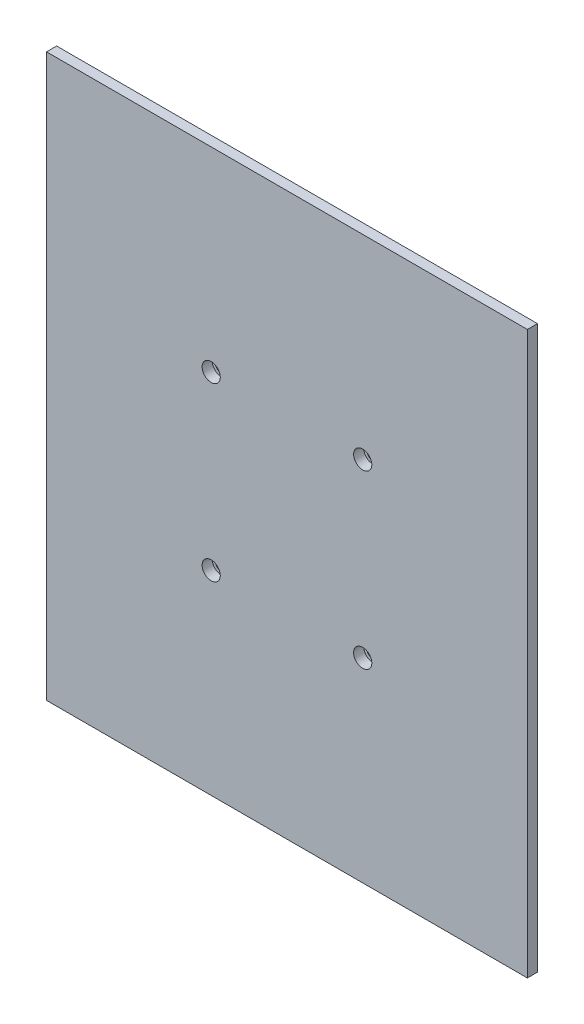
ISO-10303-21;
HEADER;
FILE_DESCRIPTION(('STEP AP214'),'2;1');
FILE_NAME('part.step','',(''),(''),'','','');
FILE_SCHEMA(('AUTOMOTIVE_DESIGN { 1 0 10303 214 1 1 1 1 }'));
ENDSEC;
DATA;
#1=APPLICATION_CONTEXT('core data for automotive mechanical design processes');
#2=APPLICATION_PROTOCOL_DEFINITION('international standard','automotive_design',2000,#1);
#3=PRODUCT_CONTEXT('',#1,'mechanical');
#4=PRODUCT('Part','Part','',(#3));
#5=PRODUCT_RELATED_PRODUCT_CATEGORY('part','',(#4));
#6=PRODUCT_DEFINITION_FORMATION('','',#4);
#7=PRODUCT_DEFINITION_CONTEXT('part definition',#1,'design');
#8=PRODUCT_DEFINITION('design','',#6,#7);
#9=PRODUCT_DEFINITION_SHAPE('','',#8);
#10=(LENGTH_UNIT() NAMED_UNIT(*) SI_UNIT(.MILLI.,.METRE.));
#11=(NAMED_UNIT(*) PLANE_ANGLE_UNIT() SI_UNIT($,.RADIAN.));
#12=(NAMED_UNIT(*) SI_UNIT($,.STERADIAN.) SOLID_ANGLE_UNIT());
#13=UNCERTAINTY_MEASURE_WITH_UNIT(LENGTH_MEASURE(1.E-05),#10,'distance_accuracy_value','');
#14=(GEOMETRIC_REPRESENTATION_CONTEXT(3) GLOBAL_UNCERTAINTY_ASSIGNED_CONTEXT((#13)) GLOBAL_UNIT_ASSIGNED_CONTEXT((#10,
#11,#12)) REPRESENTATION_CONTEXT('',''));
#15=CARTESIAN_POINT('',(0.,0.,0.));
#16=DIRECTION('',(0.,0.,1.));
#17=DIRECTION('',(1.,0.,0.));
#18=AXIS2_PLACEMENT_3D('',#15,#16,#17);
#19=CARTESIAN_POINT('',(10.,-95.,5.));
#20=DIRECTION('',(0.,0.,-1.));
#21=DIRECTION('',(-1.,0.,0.));
#22=AXIS2_PLACEMENT_3D('',#19,#20,#21);
#23=CYLINDRICAL_SURFACE('',#22,4.5);
#24=CARTESIAN_POINT('',(10.,-95.,10.));
#25=DIRECTION('',(0.,0.,-1.));
#26=DIRECTION('',(-1.,0.,0.));
#27=AXIS2_PLACEMENT_3D('',#24,#25,#26);
#28=CIRCLE('',#27,4.5);
#29=CARTESIAN_POINT('',(5.50000000000001,-95.,10.));
#30=VERTEX_POINT('',#29);
#31=EDGE_CURVE('E259',#30,#30,#28,.T.);
#32=ORIENTED_EDGE('',*,*,#31,.F.);
#33=EDGE_LOOP('',(#32));
#34=FACE_BOUND('',#33,.T.);
#35=CARTESIAN_POINT('',(10.,-95.,5.));
#36=DIRECTION('',(0.,0.,-1.));
#37=DIRECTION('',(-1.,0.,0.));
#38=AXIS2_PLACEMENT_3D('',#35,#36,#37);
#39=CIRCLE('',#38,4.5);
#40=CARTESIAN_POINT('',(5.50000000000001,-95.,5.));
#41=VERTEX_POINT('',#40);
#42=EDGE_CURVE('E11',#41,#41,#39,.F.);
#43=ORIENTED_EDGE('',*,*,#42,.F.);
#44=EDGE_LOOP('',(#43));
#45=FACE_BOUND('',#44,.T.);
#46=ADVANCED_FACE('F33',(#34,#45),#23,.F.);
#47=CARTESIAN_POINT('',(85.,-95.,5.));
#48=DIRECTION('',(0.,0.,-1.));
#49=DIRECTION('',(-1.,0.,0.));
#50=AXIS2_PLACEMENT_3D('',#47,#48,#49);
#51=CYLINDRICAL_SURFACE('',#50,4.50000000000001);
#52=CARTESIAN_POINT('',(85.,-95.,10.));
#53=DIRECTION('',(0.,0.,-1.));
#54=DIRECTION('',(-1.,0.,0.));
#55=AXIS2_PLACEMENT_3D('',#52,#53,#54);
#56=CIRCLE('',#55,4.50000000000001);
#57=CARTESIAN_POINT('',(80.5,-95.,10.));
#58=VERTEX_POINT('',#57);
#59=EDGE_CURVE('E256',#58,#58,#56,.T.);
#60=ORIENTED_EDGE('',*,*,#59,.F.);
#61=EDGE_LOOP('',(#60));
#62=FACE_BOUND('',#61,.T.);
#63=CARTESIAN_POINT('',(85.,-95.,5.));
#64=DIRECTION('',(0.,0.,-1.));
#65=DIRECTION('',(-1.,0.,0.));
#66=AXIS2_PLACEMENT_3D('',#63,#64,#65);
#67=CIRCLE('',#66,4.50000000000001);
#68=CARTESIAN_POINT('',(80.5,-95.,5.));
#69=VERTEX_POINT('',#68);
#70=EDGE_CURVE('E41',#69,#69,#67,.F.);
#71=ORIENTED_EDGE('',*,*,#70,.F.);
#72=EDGE_LOOP('',(#71));
#73=FACE_BOUND('',#72,.T.);
#74=ADVANCED_FACE('F168',(#62,#73),#51,.F.);
#75=CARTESIAN_POINT('',(10.,-9.99999999999999,5.));
#76=DIRECTION('',(0.,0.,-1.));
#77=DIRECTION('',(-1.,0.,0.));
#78=AXIS2_PLACEMENT_3D('',#75,#76,#77);
#79=CYLINDRICAL_SURFACE('',#78,4.5);
#80=CARTESIAN_POINT('',(10.,-9.99999999999999,10.));
#81=DIRECTION('',(0.,0.,-1.));
#82=DIRECTION('',(-1.,0.,0.));
#83=AXIS2_PLACEMENT_3D('',#80,#81,#82);
#84=CIRCLE('',#83,4.5);
#85=CARTESIAN_POINT('',(5.50000000000001,-9.99999999999999,10.));
#86=VERTEX_POINT('',#85);
#87=EDGE_CURVE('E254',#86,#86,#84,.T.);
#88=ORIENTED_EDGE('',*,*,#87,.F.);
#89=EDGE_LOOP('',(#88));
#90=FACE_BOUND('',#89,.T.);
#91=CARTESIAN_POINT('',(10.,-9.99999999999999,5.));
#92=DIRECTION('',(0.,0.,-1.));
#93=DIRECTION('',(-1.,0.,0.));
#94=AXIS2_PLACEMENT_3D('',#91,#92,#93);
#95=CIRCLE('',#94,4.5);
#96=CARTESIAN_POINT('',(5.50000000000001,-9.99999999999999,5.));
#97=VERTEX_POINT('',#96);
#98=EDGE_CURVE('E161',#97,#97,#95,.F.);
#99=ORIENTED_EDGE('',*,*,#98,.F.);
#100=EDGE_LOOP('',(#99));
#101=FACE_BOUND('',#100,.T.);
#102=ADVANCED_FACE('F170',(#90,#101),#79,.F.);
#103=CARTESIAN_POINT('',(85.,-9.99999999999999,5.));
#104=DIRECTION('',(0.,0.,-1.));
#105=DIRECTION('',(-1.,0.,0.));
#106=AXIS2_PLACEMENT_3D('',#103,#104,#105);
#107=CYLINDRICAL_SURFACE('',#106,4.5);
#108=CARTESIAN_POINT('',(85.,-9.99999999999999,10.));
#109=DIRECTION('',(0.,0.,-1.));
#110=DIRECTION('',(-1.,0.,0.));
#111=AXIS2_PLACEMENT_3D('',#108,#109,#110);
#112=CIRCLE('',#111,4.5);
#113=CARTESIAN_POINT('',(80.5,-9.99999999999999,10.));
#114=VERTEX_POINT('',#113);
#115=EDGE_CURVE('E103',#114,#114,#112,.T.);
#116=ORIENTED_EDGE('',*,*,#115,.F.);
#117=EDGE_LOOP('',(#116));
#118=FACE_BOUND('',#117,.T.);
#119=CARTESIAN_POINT('',(85.,-9.99999999999999,5.));
#120=DIRECTION('',(0.,0.,-1.));
#121=DIRECTION('',(-1.,0.,0.));
#122=AXIS2_PLACEMENT_3D('',#119,#120,#121);
#123=CIRCLE('',#122,4.5);
#124=CARTESIAN_POINT('',(80.5,-9.99999999999999,5.));
#125=VERTEX_POINT('',#124);
#126=EDGE_CURVE('E158',#125,#125,#123,.F.);
#127=ORIENTED_EDGE('',*,*,#126,.F.);
#128=EDGE_LOOP('',(#127));
#129=FACE_BOUND('',#128,.T.);
#130=ADVANCED_FACE('F177',(#118,#129),#107,.F.);
#131=CARTESIAN_POINT('',(166.5,86.5,10.));
#132=DIRECTION('',(1.,0.,0.));
#133=DIRECTION('',(0.,0.,-1.));
#134=AXIS2_PLACEMENT_3D('',#131,#132,#133);
#135=PLANE('',#134);
#136=DIRECTION('',(0.,0.,-1.));
#137=VECTOR('',#136,1.);
#138=CARTESIAN_POINT('',(166.5,86.5,10.));
#139=LINE('',#138,#137);
#140=CARTESIAN_POINT('',(166.5,86.5,10.));
#141=VERTEX_POINT('',#140);
#142=CARTESIAN_POINT('',(166.5,86.5,5.));
#143=VERTEX_POINT('',#142);
#144=EDGE_CURVE('E111',#141,#143,#139,.T.);
#145=ORIENTED_EDGE('',*,*,#144,.F.);
#146=DIRECTION('',(0.,-1.,0.));
#147=VECTOR('',#146,1.);
#148=CARTESIAN_POINT('',(166.5,86.5,10.));
#149=LINE('',#148,#147);
#150=CARTESIAN_POINT('',(166.5,-191.5,10.));
#151=VERTEX_POINT('',#150);
#152=EDGE_CURVE('E98',#141,#151,#149,.T.);
#153=ORIENTED_EDGE('',*,*,#152,.T.);
#154=DIRECTION('',(0.,0.,-1.));
#155=VECTOR('',#154,1.);
#156=CARTESIAN_POINT('',(166.5,-191.5,10.));
#157=LINE('',#156,#155);
#158=CARTESIAN_POINT('',(166.5,-191.5,5.));
#159=VERTEX_POINT('',#158);
#160=EDGE_CURVE('E109',#151,#159,#157,.T.);
#161=ORIENTED_EDGE('',*,*,#160,.T.);
#162=DIRECTION('',(0.,-1.,0.));
#163=VECTOR('',#162,1.);
#164=CARTESIAN_POINT('',(166.5,86.5,5.));
#165=LINE('',#164,#163);
#166=EDGE_CURVE('E112',#143,#159,#165,.T.);
#167=ORIENTED_EDGE('',*,*,#166,.F.);
#168=EDGE_LOOP('',(#145,#153,#161,#167));
#169=FACE_BOUND('',#168,.T.);
#170=ADVANCED_FACE('F107',(#169),#135,.T.);
#171=CARTESIAN_POINT('',(166.5,86.5,10.));
#172=DIRECTION('',(0.,1.,0.));
#173=DIRECTION('',(0.,0.,1.));
#174=AXIS2_PLACEMENT_3D('',#171,#172,#173);
#175=PLANE('',#174);
#176=DIRECTION('',(0.,0.,-1.));
#177=VECTOR('',#176,1.);
#178=CARTESIAN_POINT('',(-71.5,86.5,10.));
#179=LINE('',#178,#177);
#180=CARTESIAN_POINT('',(-71.5,86.5,10.));
#181=VERTEX_POINT('',#180);
#182=CARTESIAN_POINT('',(-71.5,86.5,5.));
#183=VERTEX_POINT('',#182);
#184=EDGE_CURVE('E122',#181,#183,#179,.T.);
#185=ORIENTED_EDGE('',*,*,#184,.F.);
#186=DIRECTION('',(1.,0.,0.));
#187=VECTOR('',#186,1.);
#188=CARTESIAN_POINT('',(166.5,86.5,10.));
#189=LINE('',#188,#187);
#190=EDGE_CURVE('E113',#181,#141,#189,.T.);
#191=ORIENTED_EDGE('',*,*,#190,.T.);
#192=ORIENTED_EDGE('',*,*,#144,.T.);
#193=DIRECTION('',(1.,0.,0.));
#194=VECTOR('',#193,1.);
#195=CARTESIAN_POINT('',(166.5,86.5,5.));
#196=LINE('',#195,#194);
#197=EDGE_CURVE('E120',#183,#143,#196,.T.);
#198=ORIENTED_EDGE('',*,*,#197,.F.);
#199=EDGE_LOOP('',(#185,#191,#192,#198));
#200=FACE_BOUND('',#199,.T.);
#201=ADVANCED_FACE('F278',(#200),#175,.T.);
#202=CARTESIAN_POINT('',(-71.5,86.5,10.));
#203=DIRECTION('',(-1.,0.,0.));
#204=DIRECTION('',(0.,0.,1.));
#205=AXIS2_PLACEMENT_3D('',#202,#203,#204);
#206=PLANE('',#205);
#207=DIRECTION('',(0.,0.,-1.));
#208=VECTOR('',#207,1.);
#209=CARTESIAN_POINT('',(-71.5,-191.5,10.));
#210=LINE('',#209,#208);
#211=CARTESIAN_POINT('',(-71.5,-191.5,10.));
#212=VERTEX_POINT('',#211);
#213=CARTESIAN_POINT('',(-71.5,-191.5,5.));
#214=VERTEX_POINT('',#213);
#215=EDGE_CURVE('E119',#212,#214,#210,.T.);
#216=ORIENTED_EDGE('',*,*,#215,.F.);
#217=DIRECTION('',(0.,1.,0.));
#218=VECTOR('',#217,1.);
#219=CARTESIAN_POINT('',(-71.5,86.5,10.));
#220=LINE('',#219,#218);
#221=EDGE_CURVE('E48',#212,#181,#220,.T.);
#222=ORIENTED_EDGE('',*,*,#221,.T.);
#223=ORIENTED_EDGE('',*,*,#184,.T.);
#224=DIRECTION('',(0.,1.,0.));
#225=VECTOR('',#224,1.);
#226=CARTESIAN_POINT('',(-71.5,86.5,5.));
#227=LINE('',#226,#225);
#228=EDGE_CURVE('E125',#214,#183,#227,.T.);
#229=ORIENTED_EDGE('',*,*,#228,.F.);
#230=EDGE_LOOP('',(#216,#222,#223,#229));
#231=FACE_BOUND('',#230,.T.);
#232=ADVANCED_FACE('F275',(#231),#206,.T.);
#233=CARTESIAN_POINT('',(166.5,-191.5,10.));
#234=DIRECTION('',(0.,-1.,0.));
#235=DIRECTION('',(0.,0.,-1.));
#236=AXIS2_PLACEMENT_3D('',#233,#234,#235);
#237=PLANE('',#236);
#238=ORIENTED_EDGE('',*,*,#160,.F.);
#239=DIRECTION('',(-1.,0.,0.));
#240=VECTOR('',#239,1.);
#241=CARTESIAN_POINT('',(166.5,-191.5,10.));
#242=LINE('',#241,#240);
#243=EDGE_CURVE('E95',#151,#212,#242,.T.);
#244=ORIENTED_EDGE('',*,*,#243,.T.);
#245=ORIENTED_EDGE('',*,*,#215,.T.);
#246=DIRECTION('',(-1.,0.,0.));
#247=VECTOR('',#246,1.);
#248=CARTESIAN_POINT('',(166.5,-191.5,5.));
#249=LINE('',#248,#247);
#250=EDGE_CURVE('E117',#159,#214,#249,.T.);
#251=ORIENTED_EDGE('',*,*,#250,.F.);
#252=EDGE_LOOP('',(#238,#244,#245,#251));
#253=FACE_BOUND('',#252,.T.);
#254=ADVANCED_FACE('F115',(#253),#237,.T.);
#255=CARTESIAN_POINT('',(0.,-105.,10.));
#256=DIRECTION('',(0.,1.,0.));
#257=DIRECTION('',(0.,0.,1.));
#258=AXIS2_PLACEMENT_3D('',#255,#256,#257);
#259=PLANE('',#258);
#260=DIRECTION('',(0.,0.,-1.));
#261=VECTOR('',#260,1.);
#262=CARTESIAN_POINT('',(95.,-105.,10.));
#263=LINE('',#262,#261);
#264=CARTESIAN_POINT('',(95.,-105.,5.));
#265=VERTEX_POINT('',#264);
#266=CARTESIAN_POINT('',(95.,-105.,0.));
#267=VERTEX_POINT('',#266);
#268=EDGE_CURVE('E154',#265,#267,#263,.T.);
#269=ORIENTED_EDGE('',*,*,#268,.F.);
#270=DIRECTION('',(-1.,0.,0.));
#271=VECTOR('',#270,1.);
#272=CARTESIAN_POINT('',(0.,-105.,5.));
#273=LINE('',#272,#271);
#274=CARTESIAN_POINT('',(0.,-105.,5.));
#275=VERTEX_POINT('',#274);
#276=EDGE_CURVE('E133',#265,#275,#273,.T.);
#277=ORIENTED_EDGE('',*,*,#276,.T.);
#278=DIRECTION('',(0.,0.,-1.));
#279=VECTOR('',#278,1.);
#280=CARTESIAN_POINT('',(0.,-105.,10.));
#281=LINE('',#280,#279);
#282=CARTESIAN_POINT('',(0.,-105.,0.));
#283=VERTEX_POINT('',#282);
#284=EDGE_CURVE('E148',#275,#283,#281,.T.);
#285=ORIENTED_EDGE('',*,*,#284,.T.);
#286=DIRECTION('',(1.,0.,0.));
#287=VECTOR('',#286,1.);
#288=CARTESIAN_POINT('',(0.,-105.,0.));
#289=LINE('',#288,#287);
#290=EDGE_CURVE('E136',#283,#267,#289,.T.);
#291=ORIENTED_EDGE('',*,*,#290,.T.);
#292=EDGE_LOOP('',(#269,#277,#285,#291));
#293=FACE_BOUND('',#292,.T.);
#294=ADVANCED_FACE('F35',(#293),#259,.F.);
#295=CARTESIAN_POINT('',(95.,-105.,10.));
#296=DIRECTION('',(-1.,0.,0.));
#297=DIRECTION('',(0.,0.,1.));
#298=AXIS2_PLACEMENT_3D('',#295,#296,#297);
#299=PLANE('',#298);
#300=DIRECTION('',(0.,0.,-1.));
#301=VECTOR('',#300,1.);
#302=CARTESIAN_POINT('',(95.,0.,10.));
#303=LINE('',#302,#301);
#304=CARTESIAN_POINT('',(95.,0.,5.));
#305=VERTEX_POINT('',#304);
#306=CARTESIAN_POINT('',(95.,0.,0.));
#307=VERTEX_POINT('',#306);
#308=EDGE_CURVE('E152',#305,#307,#303,.T.);
#309=ORIENTED_EDGE('',*,*,#308,.F.);
#310=DIRECTION('',(0.,-1.,0.));
#311=VECTOR('',#310,1.);
#312=CARTESIAN_POINT('',(95.,-105.,5.));
#313=LINE('',#312,#311);
#314=EDGE_CURVE('E130',#305,#265,#313,.T.);
#315=ORIENTED_EDGE('',*,*,#314,.T.);
#316=ORIENTED_EDGE('',*,*,#268,.T.);
#317=DIRECTION('',(0.,1.,0.));
#318=VECTOR('',#317,1.);
#319=CARTESIAN_POINT('',(95.,-105.,0.));
#320=LINE('',#319,#318);
#321=EDGE_CURVE('E139',#267,#307,#320,.T.);
#322=ORIENTED_EDGE('',*,*,#321,.T.);
#323=EDGE_LOOP('',(#309,#315,#316,#322));
#324=FACE_BOUND('',#323,.T.);
#325=ADVANCED_FACE('F204',(#324),#299,.F.);
#326=CARTESIAN_POINT('',(95.,0.,10.));
#327=DIRECTION('',(0.,-1.,0.));
#328=DIRECTION('',(1.,0.,0.));
#329=AXIS2_PLACEMENT_3D('',#326,#327,#328);
#330=PLANE('',#329);
#331=DIRECTION('',(0.,0.,-1.));
#332=VECTOR('',#331,1.);
#333=CARTESIAN_POINT('',(0.,0.,10.));
#334=LINE('',#333,#332);
#335=CARTESIAN_POINT('',(0.,0.,5.));
#336=VERTEX_POINT('',#335);
#337=CARTESIAN_POINT('',(0.,0.,0.));
#338=VERTEX_POINT('',#337);
#339=EDGE_CURVE('E150',#336,#338,#334,.T.);
#340=ORIENTED_EDGE('',*,*,#339,.F.);
#341=DIRECTION('',(1.,0.,0.));
#342=VECTOR('',#341,1.);
#343=CARTESIAN_POINT('',(95.,0.,5.));
#344=LINE('',#343,#342);
#345=EDGE_CURVE('E56',#336,#305,#344,.T.);
#346=ORIENTED_EDGE('',*,*,#345,.T.);
#347=ORIENTED_EDGE('',*,*,#308,.T.);
#348=DIRECTION('',(-1.,0.,0.));
#349=VECTOR('',#348,1.);
#350=CARTESIAN_POINT('',(95.,0.,0.));
#351=LINE('',#350,#349);
#352=EDGE_CURVE('E142',#307,#338,#351,.T.);
#353=ORIENTED_EDGE('',*,*,#352,.T.);
#354=EDGE_LOOP('',(#340,#346,#347,#353));
#355=FACE_BOUND('',#354,.T.);
#356=ADVANCED_FACE('F201',(#355),#330,.F.);
#357=CARTESIAN_POINT('',(0.,0.,10.));
#358=DIRECTION('',(1.,0.,0.));
#359=DIRECTION('',(0.,1.,0.));
#360=AXIS2_PLACEMENT_3D('',#357,#358,#359);
#361=PLANE('',#360);
#362=ORIENTED_EDGE('',*,*,#284,.F.);
#363=DIRECTION('',(0.,1.,0.));
#364=VECTOR('',#363,1.);
#365=CARTESIAN_POINT('',(0.,0.,5.));
#366=LINE('',#365,#364);
#367=EDGE_CURVE('E156',#275,#336,#366,.T.);
#368=ORIENTED_EDGE('',*,*,#367,.T.);
#369=ORIENTED_EDGE('',*,*,#339,.T.);
#370=DIRECTION('',(0.,-1.,0.));
#371=VECTOR('',#370,1.);
#372=CARTESIAN_POINT('',(0.,0.,0.));
#373=LINE('',#372,#371);
#374=EDGE_CURVE('E145',#338,#283,#373,.T.);
#375=ORIENTED_EDGE('',*,*,#374,.T.);
#376=EDGE_LOOP('',(#362,#368,#369,#375));
#377=FACE_BOUND('',#376,.T.);
#378=ADVANCED_FACE('F197',(#377),#361,.F.);
#379=CARTESIAN_POINT('',(0.,0.,0.));
#380=DIRECTION('',(0.,0.,1.));
#381=DIRECTION('',(1.,0.,0.));
#382=AXIS2_PLACEMENT_3D('',#379,#380,#381);
#383=PLANE('',#382);
#384=ORIENTED_EDGE('',*,*,#290,.F.);
#385=ORIENTED_EDGE('',*,*,#374,.F.);
#386=ORIENTED_EDGE('',*,*,#352,.F.);
#387=ORIENTED_EDGE('',*,*,#321,.F.);
#388=EDGE_LOOP('',(#384,#385,#386,#387));
#389=FACE_BOUND('',#388,.T.);
#390=CARTESIAN_POINT('',(85.,-9.99999999999999,0.));
#391=DIRECTION('',(0.,0.,-1.));
#392=DIRECTION('',(-1.,0.,0.));
#393=AXIS2_PLACEMENT_3D('',#390,#391,#392);
#394=CIRCLE('',#393,3.00000000000001);
#395=CARTESIAN_POINT('',(82.,-9.99999999999999,0.));
#396=VERTEX_POINT('',#395);
#397=EDGE_CURVE('E225',#396,#396,#394,.T.);
#398=ORIENTED_EDGE('',*,*,#397,.F.);
#399=EDGE_LOOP('',(#398));
#400=FACE_BOUND('',#399,.T.);
#401=CARTESIAN_POINT('',(10.,-9.99999999999999,0.));
#402=DIRECTION('',(0.,0.,-1.));
#403=DIRECTION('',(-1.,0.,0.));
#404=AXIS2_PLACEMENT_3D('',#401,#402,#403);
#405=CIRCLE('',#404,3.);
#406=CARTESIAN_POINT('',(7.00000000000001,-9.99999999999999,0.));
#407=VERTEX_POINT('',#406);
#408=EDGE_CURVE('E229',#407,#407,#405,.T.);
#409=ORIENTED_EDGE('',*,*,#408,.F.);
#410=EDGE_LOOP('',(#409));
#411=FACE_BOUND('',#410,.T.);
#412=CARTESIAN_POINT('',(85.,-95.,0.));
#413=DIRECTION('',(0.,0.,-1.));
#414=DIRECTION('',(-1.,0.,0.));
#415=AXIS2_PLACEMENT_3D('',#412,#413,#414);
#416=CIRCLE('',#415,3.00000000000001);
#417=CARTESIAN_POINT('',(82.,-95.,0.));
#418=VERTEX_POINT('',#417);
#419=EDGE_CURVE('E233',#418,#418,#416,.T.);
#420=ORIENTED_EDGE('',*,*,#419,.F.);
#421=EDGE_LOOP('',(#420));
#422=FACE_BOUND('',#421,.T.);
#423=CARTESIAN_POINT('',(10.,-95.,0.));
#424=DIRECTION('',(0.,0.,-1.));
#425=DIRECTION('',(-1.,0.,0.));
#426=AXIS2_PLACEMENT_3D('',#423,#424,#425);
#427=CIRCLE('',#426,3.);
#428=CARTESIAN_POINT('',(7.00000000000001,-95.,0.));
#429=VERTEX_POINT('',#428);
#430=EDGE_CURVE('E236',#429,#429,#427,.T.);
#431=ORIENTED_EDGE('',*,*,#430,.F.);
#432=EDGE_LOOP('',(#431));
#433=FACE_BOUND('',#432,.T.);
#434=ADVANCED_FACE('F194',(#389,#400,#411,#422,#433),#383,.F.);
#435=CARTESIAN_POINT('',(0.,0.,5.));
#436=DIRECTION('',(0.,0.,-1.));
#437=DIRECTION('',(-1.,0.,0.));
#438=AXIS2_PLACEMENT_3D('',#435,#436,#437);
#439=PLANE('',#438);
#440=ORIENTED_EDGE('',*,*,#276,.F.);
#441=ORIENTED_EDGE('',*,*,#314,.F.);
#442=ORIENTED_EDGE('',*,*,#345,.F.);
#443=ORIENTED_EDGE('',*,*,#367,.F.);
#444=EDGE_LOOP('',(#440,#441,#442,#443));
#445=FACE_BOUND('',#444,.T.);
#446=ORIENTED_EDGE('',*,*,#166,.T.);
#447=ORIENTED_EDGE('',*,*,#250,.T.);
#448=ORIENTED_EDGE('',*,*,#228,.T.);
#449=ORIENTED_EDGE('',*,*,#197,.T.);
#450=EDGE_LOOP('',(#446,#447,#448,#449));
#451=FACE_BOUND('',#450,.T.);
#452=ADVANCED_FACE('F184',(#445,#451),#439,.T.);
#453=CARTESIAN_POINT('',(0.,0.,10.));
#454=DIRECTION('',(0.,0.,1.));
#455=DIRECTION('',(1.,0.,0.));
#456=AXIS2_PLACEMENT_3D('',#453,#454,#455);
#457=PLANE('',#456);
#458=ORIENTED_EDGE('',*,*,#87,.T.);
#459=EDGE_LOOP('',(#458));
#460=FACE_BOUND('',#459,.T.);
#461=ORIENTED_EDGE('',*,*,#31,.T.);
#462=EDGE_LOOP('',(#461));
#463=FACE_BOUND('',#462,.T.);
#464=ORIENTED_EDGE('',*,*,#59,.T.);
#465=EDGE_LOOP('',(#464));
#466=FACE_BOUND('',#465,.T.);
#467=ORIENTED_EDGE('',*,*,#115,.T.);
#468=EDGE_LOOP('',(#467));
#469=FACE_BOUND('',#468,.T.);
#470=ORIENTED_EDGE('',*,*,#190,.F.);
#471=ORIENTED_EDGE('',*,*,#221,.F.);
#472=ORIENTED_EDGE('',*,*,#243,.F.);
#473=ORIENTED_EDGE('',*,*,#152,.F.);
#474=EDGE_LOOP('',(#470,#471,#472,#473));
#475=FACE_BOUND('',#474,.T.);
#476=ADVANCED_FACE('F97',(#460,#463,#466,#469,#475),#457,.T.);
#477=CARTESIAN_POINT('',(85.,-9.99999999999999,5.));
#478=DIRECTION('',(0.,0.,-1.));
#479=DIRECTION('',(-1.,0.,0.));
#480=AXIS2_PLACEMENT_3D('',#477,#478,#479);
#481=PLANE('',#480);
#482=CARTESIAN_POINT('',(85.,-9.99999999999999,5.));
#483=DIRECTION('',(0.,0.,-1.));
#484=DIRECTION('',(-1.,0.,0.));
#485=AXIS2_PLACEMENT_3D('',#482,#483,#484);
#486=CIRCLE('',#485,3.00000000000001);
#487=CARTESIAN_POINT('',(82.,-9.99999999999999,5.));
#488=VERTEX_POINT('',#487);
#489=EDGE_CURVE('E251',#488,#488,#486,.T.);
#490=ORIENTED_EDGE('',*,*,#489,.T.);
#491=EDGE_LOOP('',(#490));
#492=FACE_BOUND('',#491,.T.);
#493=ORIENTED_EDGE('',*,*,#126,.T.);
#494=EDGE_LOOP('',(#493));
#495=FACE_BOUND('',#494,.T.);
#496=ADVANCED_FACE('F192',(#492,#495),#481,.F.);
#497=CARTESIAN_POINT('',(85.,-9.99999999999999,5.));
#498=DIRECTION('',(0.,0.,-1.));
#499=DIRECTION('',(-1.,0.,0.));
#500=AXIS2_PLACEMENT_3D('',#497,#498,#499);
#501=CYLINDRICAL_SURFACE('',#500,3.00000000000001);
#502=ORIENTED_EDGE('',*,*,#489,.F.);
#503=EDGE_LOOP('',(#502));
#504=FACE_BOUND('',#503,.T.);
#505=ORIENTED_EDGE('',*,*,#397,.T.);
#506=EDGE_LOOP('',(#505));
#507=FACE_BOUND('',#506,.T.);
#508=ADVANCED_FACE('F342',(#504,#507),#501,.F.);
#509=CARTESIAN_POINT('',(10.,-9.99999999999999,5.));
#510=DIRECTION('',(0.,0.,-1.));
#511=DIRECTION('',(-1.,0.,0.));
#512=AXIS2_PLACEMENT_3D('',#509,#510,#511);
#513=PLANE('',#512);
#514=CARTESIAN_POINT('',(10.,-9.99999999999999,5.));
#515=DIRECTION('',(0.,0.,-1.));
#516=DIRECTION('',(-1.,0.,0.));
#517=AXIS2_PLACEMENT_3D('',#514,#515,#516);
#518=CIRCLE('',#517,3.);
#519=CARTESIAN_POINT('',(7.00000000000001,-9.99999999999999,5.));
#520=VERTEX_POINT('',#519);
#521=EDGE_CURVE('E247',#520,#520,#518,.T.);
#522=ORIENTED_EDGE('',*,*,#521,.T.);
#523=EDGE_LOOP('',(#522));
#524=FACE_BOUND('',#523,.T.);
#525=ORIENTED_EDGE('',*,*,#98,.T.);
#526=EDGE_LOOP('',(#525));
#527=FACE_BOUND('',#526,.T.);
#528=ADVANCED_FACE('F351',(#524,#527),#513,.F.);
#529=CARTESIAN_POINT('',(10.,-9.99999999999999,5.));
#530=DIRECTION('',(0.,0.,-1.));
#531=DIRECTION('',(-1.,0.,0.));
#532=AXIS2_PLACEMENT_3D('',#529,#530,#531);
#533=CYLINDRICAL_SURFACE('',#532,3.);
#534=ORIENTED_EDGE('',*,*,#521,.F.);
#535=EDGE_LOOP('',(#534));
#536=FACE_BOUND('',#535,.T.);
#537=ORIENTED_EDGE('',*,*,#408,.T.);
#538=EDGE_LOOP('',(#537));
#539=FACE_BOUND('',#538,.T.);
#540=ADVANCED_FACE('F360',(#536,#539),#533,.F.);
#541=CARTESIAN_POINT('',(85.,-95.,5.));
#542=DIRECTION('',(0.,0.,-1.));
#543=DIRECTION('',(-1.,0.,0.));
#544=AXIS2_PLACEMENT_3D('',#541,#542,#543);
#545=PLANE('',#544);
#546=CARTESIAN_POINT('',(85.,-95.,5.));
#547=DIRECTION('',(0.,0.,-1.));
#548=DIRECTION('',(-1.,0.,0.));
#549=AXIS2_PLACEMENT_3D('',#546,#547,#548);
#550=CIRCLE('',#549,3.00000000000001);
#551=CARTESIAN_POINT('',(82.,-95.,5.));
#552=VERTEX_POINT('',#551);
#553=EDGE_CURVE('E243',#552,#552,#550,.T.);
#554=ORIENTED_EDGE('',*,*,#553,.T.);
#555=EDGE_LOOP('',(#554));
#556=FACE_BOUND('',#555,.T.);
#557=ORIENTED_EDGE('',*,*,#70,.T.);
#558=EDGE_LOOP('',(#557));
#559=FACE_BOUND('',#558,.T.);
#560=ADVANCED_FACE('F166',(#556,#559),#545,.F.);
#561=CARTESIAN_POINT('',(85.,-95.,5.));
#562=DIRECTION('',(0.,0.,-1.));
#563=DIRECTION('',(-1.,0.,0.));
#564=AXIS2_PLACEMENT_3D('',#561,#562,#563);
#565=CYLINDRICAL_SURFACE('',#564,3.00000000000001);
#566=ORIENTED_EDGE('',*,*,#553,.F.);
#567=EDGE_LOOP('',(#566));
#568=FACE_BOUND('',#567,.T.);
#569=ORIENTED_EDGE('',*,*,#419,.T.);
#570=EDGE_LOOP('',(#569));
#571=FACE_BOUND('',#570,.T.);
#572=ADVANCED_FACE('F379',(#568,#571),#565,.F.);
#573=CARTESIAN_POINT('',(10.,-95.,5.));
#574=DIRECTION('',(0.,0.,-1.));
#575=DIRECTION('',(-1.,0.,0.));
#576=AXIS2_PLACEMENT_3D('',#573,#574,#575);
#577=PLANE('',#576);
#578=CARTESIAN_POINT('',(10.,-95.,5.));
#579=DIRECTION('',(0.,0.,-1.));
#580=DIRECTION('',(-1.,0.,0.));
#581=AXIS2_PLACEMENT_3D('',#578,#579,#580);
#582=CIRCLE('',#581,3.);
#583=CARTESIAN_POINT('',(7.00000000000001,-95.,5.));
#584=VERTEX_POINT('',#583);
#585=EDGE_CURVE('E238',#584,#584,#582,.T.);
#586=ORIENTED_EDGE('',*,*,#585,.T.);
#587=EDGE_LOOP('',(#586));
#588=FACE_BOUND('',#587,.T.);
#589=ORIENTED_EDGE('',*,*,#42,.T.);
#590=EDGE_LOOP('',(#589));
#591=FACE_BOUND('',#590,.T.);
#592=ADVANCED_FACE('F389',(#588,#591),#577,.F.);
#593=CARTESIAN_POINT('',(10.,-95.,5.));
#594=DIRECTION('',(0.,0.,-1.));
#595=DIRECTION('',(-1.,0.,0.));
#596=AXIS2_PLACEMENT_3D('',#593,#594,#595);
#597=CYLINDRICAL_SURFACE('',#596,3.);
#598=ORIENTED_EDGE('',*,*,#585,.F.);
#599=EDGE_LOOP('',(#598));
#600=FACE_BOUND('',#599,.T.);
#601=ORIENTED_EDGE('',*,*,#430,.T.);
#602=EDGE_LOOP('',(#601));
#603=FACE_BOUND('',#602,.T.);
#604=ADVANCED_FACE('F399',(#600,#603),#597,.F.);
#605=CLOSED_SHELL('',(#46,#74,#102,#130,#170,#201,#232,#254,#294,#325,#356,#378,#434,#452,#476,
#496,#508,#528,#540,#560,#572,#592,#604));
#606=MANIFOLD_SOLID_BREP('B2',#605);
#607=ADVANCED_BREP_SHAPE_REPRESENTATION('',(#18,#606),#14);
#608=SHAPE_DEFINITION_REPRESENTATION(#9,#607);
ENDSEC;
END-ISO-10303-21;
